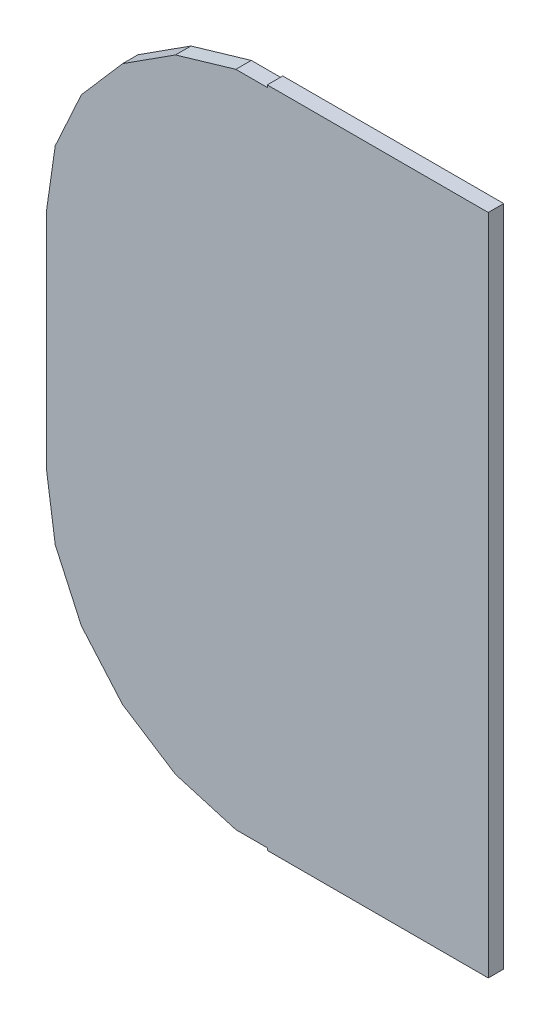
ISO-10303-21;
HEADER;
FILE_DESCRIPTION(('STEP AP214'),'2;1');
FILE_NAME('part.step','',(''),(''),'','','');
FILE_SCHEMA(('AUTOMOTIVE_DESIGN { 1 0 10303 214 1 1 1 1 }'));
ENDSEC;
DATA;
#1=APPLICATION_CONTEXT('core data for automotive mechanical design processes');
#2=APPLICATION_PROTOCOL_DEFINITION('international standard','automotive_design',2000,#1);
#3=PRODUCT_CONTEXT('',#1,'mechanical');
#4=PRODUCT('Part','Part','',(#3));
#5=PRODUCT_RELATED_PRODUCT_CATEGORY('part','',(#4));
#6=PRODUCT_DEFINITION_FORMATION('','',#4);
#7=PRODUCT_DEFINITION_CONTEXT('part definition',#1,'design');
#8=PRODUCT_DEFINITION('design','',#6,#7);
#9=PRODUCT_DEFINITION_SHAPE('','',#8);
#10=(LENGTH_UNIT() NAMED_UNIT(*) SI_UNIT(.MILLI.,.METRE.));
#11=(NAMED_UNIT(*) PLANE_ANGLE_UNIT() SI_UNIT($,.RADIAN.));
#12=(NAMED_UNIT(*) SI_UNIT($,.STERADIAN.) SOLID_ANGLE_UNIT());
#13=UNCERTAINTY_MEASURE_WITH_UNIT(LENGTH_MEASURE(1.E-05),#10,'distance_accuracy_value','');
#14=(GEOMETRIC_REPRESENTATION_CONTEXT(3) GLOBAL_UNCERTAINTY_ASSIGNED_CONTEXT((#13)) GLOBAL_UNIT_ASSIGNED_CONTEXT((#10,
#11,#12)) REPRESENTATION_CONTEXT('',''));
#15=CARTESIAN_POINT('',(0.,0.,0.));
#16=DIRECTION('',(0.,0.,1.));
#17=DIRECTION('',(1.,0.,0.));
#18=AXIS2_PLACEMENT_3D('',#15,#16,#17);
#19=CARTESIAN_POINT('',(101.60574380585,-127.7,1.635));
#20=DIRECTION('',(0.,0.,-1.));
#21=DIRECTION('',(0.,-1.,0.));
#22=AXIS2_PLACEMENT_3D('',#19,#20,#21);
#23=PLANE('',#22);
#24=DIRECTION('',(0.,-1.,0.));
#25=VECTOR('',#24,1.);
#26=CARTESIAN_POINT('',(102.05,-126.95,1.635));
#27=LINE('',#26,#25);
#28=CARTESIAN_POINT('',(102.05,-126.95,1.635));
#29=VERTEX_POINT('',#28);
#30=CARTESIAN_POINT('',(102.05,-128.45,1.635));
#31=VERTEX_POINT('',#30);
#32=EDGE_CURVE('E25',#29,#31,#27,.T.);
#33=ORIENTED_EDGE('',*,*,#32,.F.);
#34=DIRECTION('',(1.,0.,0.));
#35=VECTOR('',#34,1.);
#36=CARTESIAN_POINT('',(101.55,-126.95,1.635));
#37=LINE('',#36,#35);
#38=CARTESIAN_POINT('',(101.55,-126.95,1.635));
#39=VERTEX_POINT('',#38);
#40=EDGE_CURVE('E179',#39,#29,#37,.T.);
#41=ORIENTED_EDGE('',*,*,#40,.F.);
#42=DIRECTION('',(0.,1.,0.));
#43=VECTOR('',#42,1.);
#44=CARTESIAN_POINT('',(101.55,-126.955089,1.635));
#45=LINE('',#44,#43);
#46=CARTESIAN_POINT('',(101.55,-126.955089,1.635));
#47=VERTEX_POINT('',#46);
#48=EDGE_CURVE('E182',#47,#39,#45,.T.);
#49=ORIENTED_EDGE('',*,*,#48,.F.);
#50=DIRECTION('',(1.,0.,0.));
#51=VECTOR('',#50,1.);
#52=CARTESIAN_POINT('',(101.478843,-126.955089,1.635));
#53=LINE('',#52,#51);
#54=CARTESIAN_POINT('',(101.478843,-126.955089,1.635));
#55=VERTEX_POINT('',#54);
#56=EDGE_CURVE('E335',#55,#47,#53,.T.);
#57=ORIENTED_EDGE('',*,*,#56,.F.);
#58=DIRECTION('',(0.959492956970102,0.28173261352703,0.));
#59=VECTOR('',#58,1.);
#60=CARTESIAN_POINT('',(101.342292,-126.995184,1.635));
#61=LINE('',#60,#59);
#62=CARTESIAN_POINT('',(101.342292,-126.995184,1.635));
#63=VERTEX_POINT('',#62);
#64=EDGE_CURVE('E345',#63,#55,#61,.T.);
#65=ORIENTED_EDGE('',*,*,#64,.F.);
#66=DIRECTION('',(0.841252438274012,0.540642520616008,0.));
#67=VECTOR('',#66,1.);
#68=CARTESIAN_POINT('',(101.22257,-127.072125,1.635));
#69=LINE('',#68,#67);
#70=CARTESIAN_POINT('',(101.22257,-127.072125,1.635));
#71=VERTEX_POINT('',#70);
#72=EDGE_CURVE('E270',#71,#63,#69,.T.);
#73=ORIENTED_EDGE('',*,*,#72,.F.);
#74=DIRECTION('',(0.654860982691966,0.755749358813961,0.));
#75=VECTOR('',#74,1.);
#76=CARTESIAN_POINT('',(101.129373,-127.17968,1.635));
#77=LINE('',#76,#75);
#78=CARTESIAN_POINT('',(101.129373,-127.17968,1.635));
#79=VERTEX_POINT('',#78);
#80=EDGE_CURVE('E244',#79,#71,#77,.T.);
#81=ORIENTED_EDGE('',*,*,#80,.F.);
#82=DIRECTION('',(0.415411170560874,0.909633750128723,0.));
#83=VECTOR('',#82,1.);
#84=CARTESIAN_POINT('',(101.070254,-127.309134,1.635));
#85=LINE('',#84,#83);
#86=CARTESIAN_POINT('',(101.070254,-127.309134,1.635));
#87=VERTEX_POINT('',#86);
#88=EDGE_CURVE('E315',#87,#79,#85,.T.);
#89=ORIENTED_EDGE('',*,*,#88,.F.);
#90=DIRECTION('',(0.142318465219991,0.989820920397941,0.));
#91=VECTOR('',#90,1.);
#92=CARTESIAN_POINT('',(101.05,-127.45,1.635));
#93=LINE('',#92,#91);
#94=CARTESIAN_POINT('',(101.05,-127.45,1.635));
#95=VERTEX_POINT('',#94);
#96=EDGE_CURVE('E297',#95,#87,#93,.T.);
#97=ORIENTED_EDGE('',*,*,#96,.F.);
#98=DIRECTION('',(0.,1.,0.));
#99=VECTOR('',#98,1.);
#100=CARTESIAN_POINT('',(101.05,-127.95,1.635));
#101=LINE('',#100,#99);
#102=CARTESIAN_POINT('',(101.05,-127.95,1.635));
#103=VERTEX_POINT('',#102);
#104=EDGE_CURVE('E250',#103,#95,#101,.T.);
#105=ORIENTED_EDGE('',*,*,#104,.F.);
#106=DIRECTION('',(-0.142318465219991,0.989820920397941,0.));
#107=VECTOR('',#106,1.);
#108=CARTESIAN_POINT('',(101.070254,-128.090866,1.635));
#109=LINE('',#108,#107);
#110=CARTESIAN_POINT('',(101.070254,-128.090866,1.635));
#111=VERTEX_POINT('',#110);
#112=EDGE_CURVE('E288',#111,#103,#109,.T.);
#113=ORIENTED_EDGE('',*,*,#112,.F.);
#114=DIRECTION('',(-0.415411170560874,0.909633750128723,0.));
#115=VECTOR('',#114,1.);
#116=CARTESIAN_POINT('',(101.129373,-128.22032,1.635));
#117=LINE('',#116,#115);
#118=CARTESIAN_POINT('',(101.129373,-128.22032,1.635));
#119=VERTEX_POINT('',#118);
#120=EDGE_CURVE('E281',#119,#111,#117,.T.);
#121=ORIENTED_EDGE('',*,*,#120,.F.);
#122=DIRECTION('',(-0.654860982691966,0.755749358813961,0.));
#123=VECTOR('',#122,1.);
#124=CARTESIAN_POINT('',(101.22257,-128.327875,1.635));
#125=LINE('',#124,#123);
#126=CARTESIAN_POINT('',(101.22257,-128.327875,1.635));
#127=VERTEX_POINT('',#126);
#128=EDGE_CURVE('E261',#127,#119,#125,.T.);
#129=ORIENTED_EDGE('',*,*,#128,.F.);
#130=DIRECTION('',(-0.841252438274012,0.540642520616008,0.));
#131=VECTOR('',#130,1.);
#132=CARTESIAN_POINT('',(101.342292,-128.404816,1.635));
#133=LINE('',#132,#131);
#134=CARTESIAN_POINT('',(101.342292,-128.404816,1.635));
#135=VERTEX_POINT('',#134);
#136=EDGE_CURVE('E234',#135,#127,#133,.T.);
#137=ORIENTED_EDGE('',*,*,#136,.F.);
#138=DIRECTION('',(-0.959492956970102,0.28173261352703,0.));
#139=VECTOR('',#138,1.);
#140=CARTESIAN_POINT('',(101.478843,-128.444911,1.635));
#141=LINE('',#140,#139);
#142=CARTESIAN_POINT('',(101.478843,-128.444911,1.635));
#143=VERTEX_POINT('',#142);
#144=EDGE_CURVE('E252',#143,#135,#141,.T.);
#145=ORIENTED_EDGE('',*,*,#144,.F.);
#146=DIRECTION('',(-1.,0.,0.));
#147=VECTOR('',#146,1.);
#148=CARTESIAN_POINT('',(101.55,-128.444911,1.635));
#149=LINE('',#148,#147);
#150=CARTESIAN_POINT('',(101.55,-128.444911,1.635));
#151=VERTEX_POINT('',#150);
#152=EDGE_CURVE('E235',#151,#143,#149,.T.);
#153=ORIENTED_EDGE('',*,*,#152,.F.);
#154=DIRECTION('',(0.,1.,0.));
#155=VECTOR('',#154,1.);
#156=CARTESIAN_POINT('',(101.55,-128.45,1.635));
#157=LINE('',#156,#155);
#158=CARTESIAN_POINT('',(101.55,-128.45,1.635));
#159=VERTEX_POINT('',#158);
#160=EDGE_CURVE('E369',#159,#151,#157,.T.);
#161=ORIENTED_EDGE('',*,*,#160,.F.);
#162=DIRECTION('',(-1.,0.,0.));
#163=VECTOR('',#162,1.);
#164=CARTESIAN_POINT('',(102.05,-128.45,1.635));
#165=LINE('',#164,#163);
#166=EDGE_CURVE('E394',#31,#159,#165,.T.);
#167=ORIENTED_EDGE('',*,*,#166,.F.);
#168=EDGE_LOOP('',(#33,#41,#49,#57,#65,#73,#81,#89,#97,#105,#113,#121,#129,#137,#145,#153,#161,#167));
#169=FACE_BOUND('',#168,.T.);
#170=ADVANCED_FACE('F17',(#169),#23,.F.);
#171=CARTESIAN_POINT('',(101.60574380585,-127.7,1.6));
#172=DIRECTION('',(0.,0.,-1.));
#173=DIRECTION('',(0.,-1.,0.));
#174=AXIS2_PLACEMENT_3D('',#171,#172,#173);
#175=PLANE('',#174);
#176=DIRECTION('',(-1.,0.,0.));
#177=VECTOR('',#176,1.);
#178=CARTESIAN_POINT('',(102.05,-128.45,1.6));
#179=LINE('',#178,#177);
#180=CARTESIAN_POINT('',(102.05,-128.45,1.6));
#181=VERTEX_POINT('',#180);
#182=CARTESIAN_POINT('',(101.55,-128.45,1.6));
#183=VERTEX_POINT('',#182);
#184=EDGE_CURVE('E374',#181,#183,#179,.T.);
#185=ORIENTED_EDGE('',*,*,#184,.T.);
#186=DIRECTION('',(0.,1.,0.));
#187=VECTOR('',#186,1.);
#188=CARTESIAN_POINT('',(101.55,-128.45,1.6));
#189=LINE('',#188,#187);
#190=CARTESIAN_POINT('',(101.55,-128.444911,1.6));
#191=VERTEX_POINT('',#190);
#192=EDGE_CURVE('E227',#183,#191,#189,.T.);
#193=ORIENTED_EDGE('',*,*,#192,.T.);
#194=DIRECTION('',(-1.,0.,0.));
#195=VECTOR('',#194,1.);
#196=CARTESIAN_POINT('',(101.55,-128.444911,1.6));
#197=LINE('',#196,#195);
#198=CARTESIAN_POINT('',(101.478843,-128.444911,1.6));
#199=VERTEX_POINT('',#198);
#200=EDGE_CURVE('E257',#191,#199,#197,.T.);
#201=ORIENTED_EDGE('',*,*,#200,.T.);
#202=DIRECTION('',(-0.959492956970102,0.28173261352703,0.));
#203=VECTOR('',#202,1.);
#204=CARTESIAN_POINT('',(101.478843,-128.444911,1.6));
#205=LINE('',#204,#203);
#206=CARTESIAN_POINT('',(101.342292,-128.404816,1.6));
#207=VERTEX_POINT('',#206);
#208=EDGE_CURVE('E365',#199,#207,#205,.T.);
#209=ORIENTED_EDGE('',*,*,#208,.T.);
#210=DIRECTION('',(-0.841252438274012,0.540642520616008,0.));
#211=VECTOR('',#210,1.);
#212=CARTESIAN_POINT('',(101.342292,-128.404816,1.6));
#213=LINE('',#212,#211);
#214=CARTESIAN_POINT('',(101.22257,-128.327875,1.6));
#215=VERTEX_POINT('',#214);
#216=EDGE_CURVE('E233',#207,#215,#213,.T.);
#217=ORIENTED_EDGE('',*,*,#216,.T.);
#218=DIRECTION('',(-0.654860982691966,0.755749358813961,0.));
#219=VECTOR('',#218,1.);
#220=CARTESIAN_POINT('',(101.22257,-128.327875,1.6));
#221=LINE('',#220,#219);
#222=CARTESIAN_POINT('',(101.129373,-128.22032,1.6));
#223=VERTEX_POINT('',#222);
#224=EDGE_CURVE('E275',#215,#223,#221,.T.);
#225=ORIENTED_EDGE('',*,*,#224,.T.);
#226=DIRECTION('',(-0.415411170560874,0.909633750128723,0.));
#227=VECTOR('',#226,1.);
#228=CARTESIAN_POINT('',(101.129373,-128.22032,1.6));
#229=LINE('',#228,#227);
#230=CARTESIAN_POINT('',(101.070254,-128.090866,1.6));
#231=VERTEX_POINT('',#230);
#232=EDGE_CURVE('E280',#223,#231,#229,.T.);
#233=ORIENTED_EDGE('',*,*,#232,.T.);
#234=DIRECTION('',(-0.142318465219991,0.989820920397941,0.));
#235=VECTOR('',#234,1.);
#236=CARTESIAN_POINT('',(101.070254,-128.090866,1.6));
#237=LINE('',#236,#235);
#238=CARTESIAN_POINT('',(101.05,-127.95,1.6));
#239=VERTEX_POINT('',#238);
#240=EDGE_CURVE('E246',#231,#239,#237,.T.);
#241=ORIENTED_EDGE('',*,*,#240,.T.);
#242=DIRECTION('',(0.,1.,0.));
#243=VECTOR('',#242,1.);
#244=CARTESIAN_POINT('',(101.05,-127.95,1.6));
#245=LINE('',#244,#243);
#246=CARTESIAN_POINT('',(101.05,-127.45,1.6));
#247=VERTEX_POINT('',#246);
#248=EDGE_CURVE('E305',#239,#247,#245,.T.);
#249=ORIENTED_EDGE('',*,*,#248,.T.);
#250=DIRECTION('',(0.142318465219991,0.989820920397941,0.));
#251=VECTOR('',#250,1.);
#252=CARTESIAN_POINT('',(101.05,-127.45,1.6));
#253=LINE('',#252,#251);
#254=CARTESIAN_POINT('',(101.070254,-127.309134,1.6));
#255=VERTEX_POINT('',#254);
#256=EDGE_CURVE('E296',#247,#255,#253,.T.);
#257=ORIENTED_EDGE('',*,*,#256,.T.);
#258=DIRECTION('',(0.415411170560874,0.909633750128723,0.));
#259=VECTOR('',#258,1.);
#260=CARTESIAN_POINT('',(101.070254,-127.309134,1.6));
#261=LINE('',#260,#259);
#262=CARTESIAN_POINT('',(101.129373,-127.17968,1.6));
#263=VERTEX_POINT('',#262);
#264=EDGE_CURVE('E240',#255,#263,#261,.T.);
#265=ORIENTED_EDGE('',*,*,#264,.T.);
#266=DIRECTION('',(0.654860982691966,0.755749358813961,0.));
#267=VECTOR('',#266,1.);
#268=CARTESIAN_POINT('',(101.129373,-127.17968,1.6));
#269=LINE('',#268,#267);
#270=CARTESIAN_POINT('',(101.22257,-127.072125,1.6));
#271=VERTEX_POINT('',#270);
#272=EDGE_CURVE('E266',#263,#271,#269,.T.);
#273=ORIENTED_EDGE('',*,*,#272,.T.);
#274=DIRECTION('',(0.841252438274012,0.540642520616008,0.));
#275=VECTOR('',#274,1.);
#276=CARTESIAN_POINT('',(101.22257,-127.072125,1.6));
#277=LINE('',#276,#275);
#278=CARTESIAN_POINT('',(101.342292,-126.995184,1.6));
#279=VERTEX_POINT('',#278);
#280=EDGE_CURVE('E331',#271,#279,#277,.T.);
#281=ORIENTED_EDGE('',*,*,#280,.T.);
#282=DIRECTION('',(0.959492956970102,0.28173261352703,0.));
#283=VECTOR('',#282,1.);
#284=CARTESIAN_POINT('',(101.342292,-126.995184,1.6));
#285=LINE('',#284,#283);
#286=CARTESIAN_POINT('',(101.478843,-126.955089,1.6));
#287=VERTEX_POINT('',#286);
#288=EDGE_CURVE('E332',#279,#287,#285,.T.);
#289=ORIENTED_EDGE('',*,*,#288,.T.);
#290=DIRECTION('',(1.,0.,0.));
#291=VECTOR('',#290,1.);
#292=CARTESIAN_POINT('',(101.478843,-126.955089,1.6));
#293=LINE('',#292,#291);
#294=CARTESIAN_POINT('',(101.55,-126.955089,1.6));
#295=VERTEX_POINT('',#294);
#296=EDGE_CURVE('E203',#287,#295,#293,.T.);
#297=ORIENTED_EDGE('',*,*,#296,.T.);
#298=DIRECTION('',(0.,1.,0.));
#299=VECTOR('',#298,1.);
#300=CARTESIAN_POINT('',(101.55,-126.955089,1.6));
#301=LINE('',#300,#299);
#302=CARTESIAN_POINT('',(101.55,-126.95,1.6));
#303=VERTEX_POINT('',#302);
#304=EDGE_CURVE('E188',#295,#303,#301,.T.);
#305=ORIENTED_EDGE('',*,*,#304,.T.);
#306=DIRECTION('',(1.,0.,0.));
#307=VECTOR('',#306,1.);
#308=CARTESIAN_POINT('',(101.55,-126.95,1.6));
#309=LINE('',#308,#307);
#310=CARTESIAN_POINT('',(102.05,-126.95,1.6));
#311=VERTEX_POINT('',#310);
#312=EDGE_CURVE('E193',#303,#311,#309,.T.);
#313=ORIENTED_EDGE('',*,*,#312,.T.);
#314=DIRECTION('',(0.,-1.,0.));
#315=VECTOR('',#314,1.);
#316=CARTESIAN_POINT('',(102.05,-126.95,1.6));
#317=LINE('',#316,#315);
#318=EDGE_CURVE('E11',#311,#181,#317,.T.);
#319=ORIENTED_EDGE('',*,*,#318,.T.);
#320=EDGE_LOOP('',(#185,#193,#201,#209,#217,#225,#233,#241,#249,#257,#265,#273,#281,#289,#297,
#305,#313,#319));
#321=FACE_BOUND('',#320,.T.);
#322=ADVANCED_FACE('F421',(#321),#175,.T.);
#323=CARTESIAN_POINT('',(102.05,-126.95,1.6));
#324=DIRECTION('',(1.,0.,0.));
#325=DIRECTION('',(0.,1.,0.));
#326=AXIS2_PLACEMENT_3D('',#323,#324,#325);
#327=PLANE('',#326);
#328=DIRECTION('',(0.,0.,1.));
#329=VECTOR('',#328,1.);
#330=CARTESIAN_POINT('',(102.05,-126.95,1.6));
#331=LINE('',#330,#329);
#332=EDGE_CURVE('E187',#311,#29,#331,.T.);
#333=ORIENTED_EDGE('',*,*,#332,.T.);
#334=ORIENTED_EDGE('',*,*,#32,.T.);
#335=DIRECTION('',(0.,0.,1.));
#336=VECTOR('',#335,1.);
#337=CARTESIAN_POINT('',(102.05,-128.45,1.6));
#338=LINE('',#337,#336);
#339=EDGE_CURVE('E397',#181,#31,#338,.T.);
#340=ORIENTED_EDGE('',*,*,#339,.F.);
#341=ORIENTED_EDGE('',*,*,#318,.F.);
#342=EDGE_LOOP('',(#333,#334,#340,#341));
#343=FACE_BOUND('',#342,.T.);
#344=ADVANCED_FACE('F426',(#343),#327,.T.);
#345=CARTESIAN_POINT('',(101.55,-126.95,1.6));
#346=DIRECTION('',(0.,1.,0.));
#347=DIRECTION('',(1.,0.,0.));
#348=AXIS2_PLACEMENT_3D('',#345,#346,#347);
#349=PLANE('',#348);
#350=DIRECTION('',(0.,0.,1.));
#351=VECTOR('',#350,1.);
#352=CARTESIAN_POINT('',(101.55,-126.95,1.6));
#353=LINE('',#352,#351);
#354=EDGE_CURVE('E191',#303,#39,#353,.T.);
#355=ORIENTED_EDGE('',*,*,#354,.T.);
#356=ORIENTED_EDGE('',*,*,#40,.T.);
#357=ORIENTED_EDGE('',*,*,#332,.F.);
#358=ORIENTED_EDGE('',*,*,#312,.F.);
#359=EDGE_LOOP('',(#355,#356,#357,#358));
#360=FACE_BOUND('',#359,.T.);
#361=ADVANCED_FACE('F192',(#360),#349,.T.);
#362=CARTESIAN_POINT('',(101.55,-126.955089,1.6));
#363=DIRECTION('',(-1.,0.,0.));
#364=DIRECTION('',(0.,0.,1.));
#365=AXIS2_PLACEMENT_3D('',#362,#363,#364);
#366=PLANE('',#365);
#367=DIRECTION('',(0.,0.,1.));
#368=VECTOR('',#367,1.);
#369=CARTESIAN_POINT('',(101.55,-126.955089,1.6));
#370=LINE('',#369,#368);
#371=EDGE_CURVE('E200',#295,#47,#370,.T.);
#372=ORIENTED_EDGE('',*,*,#371,.T.);
#373=ORIENTED_EDGE('',*,*,#48,.T.);
#374=ORIENTED_EDGE('',*,*,#354,.F.);
#375=ORIENTED_EDGE('',*,*,#304,.F.);
#376=EDGE_LOOP('',(#372,#373,#374,#375));
#377=FACE_BOUND('',#376,.T.);
#378=ADVANCED_FACE('F198',(#377),#366,.T.);
#379=CARTESIAN_POINT('',(101.478843,-126.955089,1.6));
#380=DIRECTION('',(0.,1.,0.));
#381=DIRECTION('',(1.,0.,0.));
#382=AXIS2_PLACEMENT_3D('',#379,#380,#381);
#383=PLANE('',#382);
#384=DIRECTION('',(0.,0.,1.));
#385=VECTOR('',#384,1.);
#386=CARTESIAN_POINT('',(101.478843,-126.955089,1.6));
#387=LINE('',#386,#385);
#388=EDGE_CURVE('E336',#287,#55,#387,.T.);
#389=ORIENTED_EDGE('',*,*,#388,.T.);
#390=ORIENTED_EDGE('',*,*,#56,.T.);
#391=ORIENTED_EDGE('',*,*,#371,.F.);
#392=ORIENTED_EDGE('',*,*,#296,.F.);
#393=EDGE_LOOP('',(#389,#390,#391,#392));
#394=FACE_BOUND('',#393,.T.);
#395=ADVANCED_FACE('F435',(#394),#383,.T.);
#396=CARTESIAN_POINT('',(101.342292,-126.995184,1.6));
#397=DIRECTION('',(-0.28173261352703,0.959492956970102,0.));
#398=DIRECTION('',(0.,0.,1.));
#399=AXIS2_PLACEMENT_3D('',#396,#397,#398);
#400=PLANE('',#399);
#401=DIRECTION('',(0.,0.,1.));
#402=VECTOR('',#401,1.);
#403=CARTESIAN_POINT('',(101.342292,-126.995184,1.6));
#404=LINE('',#403,#402);
#405=EDGE_CURVE('E328',#279,#63,#404,.T.);
#406=ORIENTED_EDGE('',*,*,#405,.T.);
#407=ORIENTED_EDGE('',*,*,#64,.T.);
#408=ORIENTED_EDGE('',*,*,#388,.F.);
#409=ORIENTED_EDGE('',*,*,#288,.F.);
#410=EDGE_LOOP('',(#406,#407,#408,#409));
#411=FACE_BOUND('',#410,.T.);
#412=ADVANCED_FACE('F438',(#411),#400,.T.);
#413=CARTESIAN_POINT('',(101.22257,-127.072125,1.6));
#414=DIRECTION('',(-0.540642520616008,0.841252438274012,0.));
#415=DIRECTION('',(0.,0.,1.));
#416=AXIS2_PLACEMENT_3D('',#413,#414,#415);
#417=PLANE('',#416);
#418=DIRECTION('',(0.,0.,1.));
#419=VECTOR('',#418,1.);
#420=CARTESIAN_POINT('',(101.22257,-127.072125,1.6));
#421=LINE('',#420,#419);
#422=EDGE_CURVE('E271',#271,#71,#421,.T.);
#423=ORIENTED_EDGE('',*,*,#422,.T.);
#424=ORIENTED_EDGE('',*,*,#72,.T.);
#425=ORIENTED_EDGE('',*,*,#405,.F.);
#426=ORIENTED_EDGE('',*,*,#280,.F.);
#427=EDGE_LOOP('',(#423,#424,#425,#426));
#428=FACE_BOUND('',#427,.T.);
#429=ADVANCED_FACE('F443',(#428),#417,.T.);
#430=CARTESIAN_POINT('',(101.129373,-127.17968,1.6));
#431=DIRECTION('',(-0.755749358813961,0.654860982691966,0.));
#432=DIRECTION('',(0.,0.,1.));
#433=AXIS2_PLACEMENT_3D('',#430,#431,#432);
#434=PLANE('',#433);
#435=DIRECTION('',(0.,0.,1.));
#436=VECTOR('',#435,1.);
#437=CARTESIAN_POINT('',(101.129373,-127.17968,1.6));
#438=LINE('',#437,#436);
#439=EDGE_CURVE('E245',#263,#79,#438,.T.);
#440=ORIENTED_EDGE('',*,*,#439,.T.);
#441=ORIENTED_EDGE('',*,*,#80,.T.);
#442=ORIENTED_EDGE('',*,*,#422,.F.);
#443=ORIENTED_EDGE('',*,*,#272,.F.);
#444=EDGE_LOOP('',(#440,#441,#442,#443));
#445=FACE_BOUND('',#444,.T.);
#446=ADVANCED_FACE('F439',(#445),#434,.T.);
#447=CARTESIAN_POINT('',(101.070254,-127.309134,1.6));
#448=DIRECTION('',(-0.909633750128723,0.415411170560874,0.));
#449=DIRECTION('',(0.,0.,1.));
#450=AXIS2_PLACEMENT_3D('',#447,#448,#449);
#451=PLANE('',#450);
#452=DIRECTION('',(0.,0.,1.));
#453=VECTOR('',#452,1.);
#454=CARTESIAN_POINT('',(101.070254,-127.309134,1.6));
#455=LINE('',#454,#453);
#456=EDGE_CURVE('E292',#255,#87,#455,.T.);
#457=ORIENTED_EDGE('',*,*,#456,.T.);
#458=ORIENTED_EDGE('',*,*,#88,.T.);
#459=ORIENTED_EDGE('',*,*,#439,.F.);
#460=ORIENTED_EDGE('',*,*,#264,.F.);
#461=EDGE_LOOP('',(#457,#458,#459,#460));
#462=FACE_BOUND('',#461,.T.);
#463=ADVANCED_FACE('F442',(#462),#451,.T.);
#464=CARTESIAN_POINT('',(101.05,-127.45,1.6));
#465=DIRECTION('',(-0.989820920397941,0.142318465219991,0.));
#466=DIRECTION('',(0.,0.,1.));
#467=AXIS2_PLACEMENT_3D('',#464,#465,#466);
#468=PLANE('',#467);
#469=DIRECTION('',(0.,0.,1.));
#470=VECTOR('',#469,1.);
#471=CARTESIAN_POINT('',(101.05,-127.45,1.6));
#472=LINE('',#471,#470);
#473=EDGE_CURVE('E301',#247,#95,#472,.T.);
#474=ORIENTED_EDGE('',*,*,#473,.T.);
#475=ORIENTED_EDGE('',*,*,#96,.T.);
#476=ORIENTED_EDGE('',*,*,#456,.F.);
#477=ORIENTED_EDGE('',*,*,#256,.F.);
#478=EDGE_LOOP('',(#474,#475,#476,#477));
#479=FACE_BOUND('',#478,.T.);
#480=ADVANCED_FACE('F447',(#479),#468,.T.);
#481=CARTESIAN_POINT('',(101.05,-127.95,1.6));
#482=DIRECTION('',(-1.,0.,0.));
#483=DIRECTION('',(0.,0.,1.));
#484=AXIS2_PLACEMENT_3D('',#481,#482,#483);
#485=PLANE('',#484);
#486=DIRECTION('',(0.,0.,1.));
#487=VECTOR('',#486,1.);
#488=CARTESIAN_POINT('',(101.05,-127.95,1.6));
#489=LINE('',#488,#487);
#490=EDGE_CURVE('E251',#239,#103,#489,.T.);
#491=ORIENTED_EDGE('',*,*,#490,.T.);
#492=ORIENTED_EDGE('',*,*,#104,.T.);
#493=ORIENTED_EDGE('',*,*,#473,.F.);
#494=ORIENTED_EDGE('',*,*,#248,.F.);
#495=EDGE_LOOP('',(#491,#492,#493,#494));
#496=FACE_BOUND('',#495,.T.);
#497=ADVANCED_FACE('F454',(#496),#485,.T.);
#498=CARTESIAN_POINT('',(101.070254,-128.090866,1.6));
#499=DIRECTION('',(-0.989820920397941,-0.142318465219991,0.));
#500=DIRECTION('',(-0.142318465219991,0.989820920397941,0.));
#501=AXIS2_PLACEMENT_3D('',#498,#499,#500);
#502=PLANE('',#501);
#503=DIRECTION('',(0.,0.,1.));
#504=VECTOR('',#503,1.);
#505=CARTESIAN_POINT('',(101.070254,-128.090866,1.6));
#506=LINE('',#505,#504);
#507=EDGE_CURVE('E276',#231,#111,#506,.T.);
#508=ORIENTED_EDGE('',*,*,#507,.T.);
#509=ORIENTED_EDGE('',*,*,#112,.T.);
#510=ORIENTED_EDGE('',*,*,#490,.F.);
#511=ORIENTED_EDGE('',*,*,#240,.F.);
#512=EDGE_LOOP('',(#508,#509,#510,#511));
#513=FACE_BOUND('',#512,.T.);
#514=ADVANCED_FACE('F458',(#513),#502,.T.);
#515=CARTESIAN_POINT('',(101.129373,-128.22032,1.6));
#516=DIRECTION('',(-0.909633750128723,-0.415411170560874,0.));
#517=DIRECTION('',(-0.415411170560874,0.909633750128723,0.));
#518=AXIS2_PLACEMENT_3D('',#515,#516,#517);
#519=PLANE('',#518);
#520=DIRECTION('',(0.,0.,1.));
#521=VECTOR('',#520,1.);
#522=CARTESIAN_POINT('',(101.129373,-128.22032,1.6));
#523=LINE('',#522,#521);
#524=EDGE_CURVE('E265',#223,#119,#523,.T.);
#525=ORIENTED_EDGE('',*,*,#524,.T.);
#526=ORIENTED_EDGE('',*,*,#120,.T.);
#527=ORIENTED_EDGE('',*,*,#507,.F.);
#528=ORIENTED_EDGE('',*,*,#232,.F.);
#529=EDGE_LOOP('',(#525,#526,#527,#528));
#530=FACE_BOUND('',#529,.T.);
#531=ADVANCED_FACE('F460',(#530),#519,.T.);
#532=CARTESIAN_POINT('',(101.22257,-128.327875,1.6));
#533=DIRECTION('',(-0.755749358813961,-0.654860982691966,0.));
#534=DIRECTION('',(-0.654860982691966,0.755749358813961,0.));
#535=AXIS2_PLACEMENT_3D('',#532,#533,#534);
#536=PLANE('',#535);
#537=DIRECTION('',(0.,0.,1.));
#538=VECTOR('',#537,1.);
#539=CARTESIAN_POINT('',(101.22257,-128.327875,1.6));
#540=LINE('',#539,#538);
#541=EDGE_CURVE('E229',#215,#127,#540,.T.);
#542=ORIENTED_EDGE('',*,*,#541,.T.);
#543=ORIENTED_EDGE('',*,*,#128,.T.);
#544=ORIENTED_EDGE('',*,*,#524,.F.);
#545=ORIENTED_EDGE('',*,*,#224,.F.);
#546=EDGE_LOOP('',(#542,#543,#544,#545));
#547=FACE_BOUND('',#546,.T.);
#548=ADVANCED_FACE('F419',(#547),#536,.T.);
#549=CARTESIAN_POINT('',(101.342292,-128.404816,1.6));
#550=DIRECTION('',(-0.540642520616008,-0.841252438274012,0.));
#551=DIRECTION('',(-0.841252438274012,0.540642520616008,0.));
#552=AXIS2_PLACEMENT_3D('',#549,#550,#551);
#553=PLANE('',#552);
#554=DIRECTION('',(0.,0.,1.));
#555=VECTOR('',#554,1.);
#556=CARTESIAN_POINT('',(101.342292,-128.404816,1.6));
#557=LINE('',#556,#555);
#558=EDGE_CURVE('E256',#207,#135,#557,.T.);
#559=ORIENTED_EDGE('',*,*,#558,.T.);
#560=ORIENTED_EDGE('',*,*,#136,.T.);
#561=ORIENTED_EDGE('',*,*,#541,.F.);
#562=ORIENTED_EDGE('',*,*,#216,.F.);
#563=EDGE_LOOP('',(#559,#560,#561,#562));
#564=FACE_BOUND('',#563,.T.);
#565=ADVANCED_FACE('F417',(#564),#553,.T.);
#566=CARTESIAN_POINT('',(101.478843,-128.444911,1.6));
#567=DIRECTION('',(-0.28173261352703,-0.959492956970102,0.));
#568=DIRECTION('',(-0.959492956970102,0.28173261352703,0.));
#569=AXIS2_PLACEMENT_3D('',#566,#567,#568);
#570=PLANE('',#569);
#571=DIRECTION('',(0.,0.,1.));
#572=VECTOR('',#571,1.);
#573=CARTESIAN_POINT('',(101.478843,-128.444911,1.6));
#574=LINE('',#573,#572);
#575=EDGE_CURVE('E239',#199,#143,#574,.T.);
#576=ORIENTED_EDGE('',*,*,#575,.T.);
#577=ORIENTED_EDGE('',*,*,#144,.T.);
#578=ORIENTED_EDGE('',*,*,#558,.F.);
#579=ORIENTED_EDGE('',*,*,#208,.F.);
#580=EDGE_LOOP('',(#576,#577,#578,#579));
#581=FACE_BOUND('',#580,.T.);
#582=ADVANCED_FACE('F411',(#581),#570,.T.);
#583=CARTESIAN_POINT('',(101.55,-128.444911,1.6));
#584=DIRECTION('',(0.,-1.,0.));
#585=DIRECTION('',(0.,0.,-1.));
#586=AXIS2_PLACEMENT_3D('',#583,#584,#585);
#587=PLANE('',#586);
#588=DIRECTION('',(0.,0.,1.));
#589=VECTOR('',#588,1.);
#590=CARTESIAN_POINT('',(101.55,-128.444911,1.6));
#591=LINE('',#590,#589);
#592=EDGE_CURVE('E373',#191,#151,#591,.T.);
#593=ORIENTED_EDGE('',*,*,#592,.T.);
#594=ORIENTED_EDGE('',*,*,#152,.T.);
#595=ORIENTED_EDGE('',*,*,#575,.F.);
#596=ORIENTED_EDGE('',*,*,#200,.F.);
#597=EDGE_LOOP('',(#593,#594,#595,#596));
#598=FACE_BOUND('',#597,.T.);
#599=ADVANCED_FACE('F413',(#598),#587,.T.);
#600=CARTESIAN_POINT('',(101.55,-128.45,1.6));
#601=DIRECTION('',(-1.,0.,0.));
#602=DIRECTION('',(0.,0.,1.));
#603=AXIS2_PLACEMENT_3D('',#600,#601,#602);
#604=PLANE('',#603);
#605=DIRECTION('',(0.,0.,1.));
#606=VECTOR('',#605,1.);
#607=CARTESIAN_POINT('',(101.55,-128.45,1.6));
#608=LINE('',#607,#606);
#609=EDGE_CURVE('E355',#183,#159,#608,.T.);
#610=ORIENTED_EDGE('',*,*,#609,.T.);
#611=ORIENTED_EDGE('',*,*,#160,.T.);
#612=ORIENTED_EDGE('',*,*,#592,.F.);
#613=ORIENTED_EDGE('',*,*,#192,.F.);
#614=EDGE_LOOP('',(#610,#611,#612,#613));
#615=FACE_BOUND('',#614,.T.);
#616=ADVANCED_FACE('F473',(#615),#604,.T.);
#617=CARTESIAN_POINT('',(102.05,-128.45,1.6));
#618=DIRECTION('',(0.,-1.,0.));
#619=DIRECTION('',(0.,0.,-1.));
#620=AXIS2_PLACEMENT_3D('',#617,#618,#619);
#621=PLANE('',#620);
#622=ORIENTED_EDGE('',*,*,#339,.T.);
#623=ORIENTED_EDGE('',*,*,#166,.T.);
#624=ORIENTED_EDGE('',*,*,#609,.F.);
#625=ORIENTED_EDGE('',*,*,#184,.F.);
#626=EDGE_LOOP('',(#622,#623,#624,#625));
#627=FACE_BOUND('',#626,.T.);
#628=ADVANCED_FACE('F482',(#627),#621,.T.);
#629=CLOSED_SHELL('',(#170,#322,#344,#361,#378,#395,#412,#429,#446,#463,#480,#497,#514,#531,
#548,#565,#582,#599,#616,#628));
#630=MANIFOLD_SOLID_BREP('B1',#629);
#631=ADVANCED_BREP_SHAPE_REPRESENTATION('',(#18,#630),#14);
#632=SHAPE_DEFINITION_REPRESENTATION(#9,#631);
ENDSEC;
END-ISO-10303-21;
